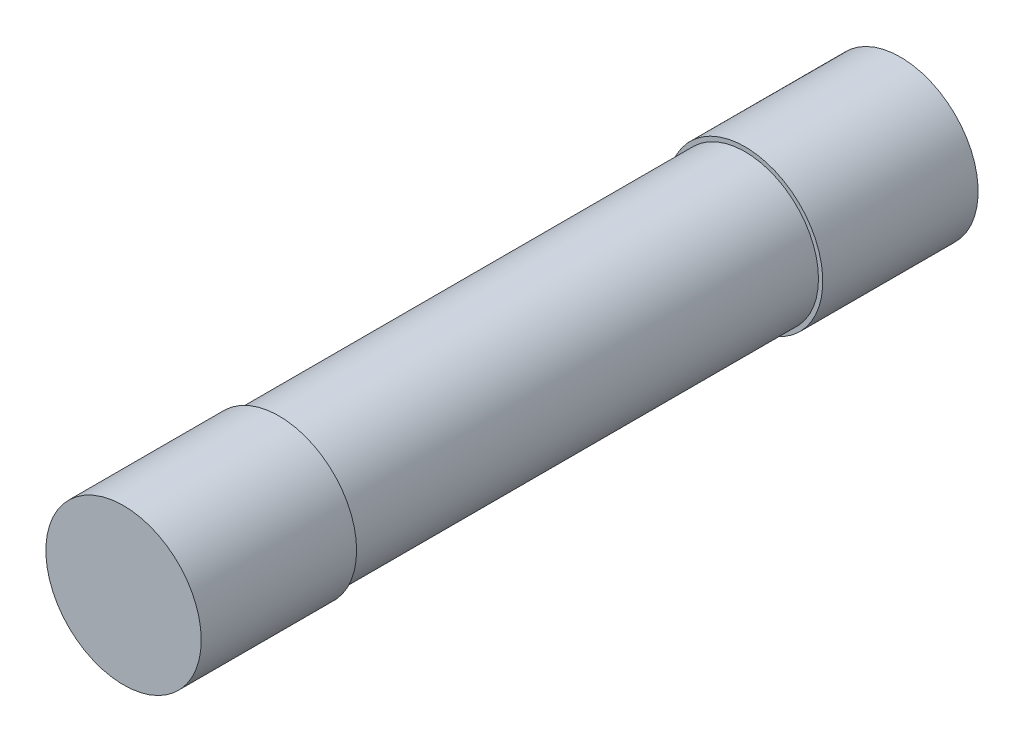
ISO-10303-21;
HEADER;
FILE_DESCRIPTION(('STEP AP214'),'2;1');
FILE_NAME('part.step','',(''),(''),'','','');
FILE_SCHEMA(('AUTOMOTIVE_DESIGN { 1 0 10303 214 1 1 1 1 }'));
ENDSEC;
DATA;
#1=APPLICATION_CONTEXT('core data for automotive mechanical design processes');
#2=APPLICATION_PROTOCOL_DEFINITION('international standard','automotive_design',2000,#1);
#3=PRODUCT_CONTEXT('',#1,'mechanical');
#4=PRODUCT('Part','Part','',(#3));
#5=PRODUCT_RELATED_PRODUCT_CATEGORY('part','',(#4));
#6=PRODUCT_DEFINITION_FORMATION('','',#4);
#7=PRODUCT_DEFINITION_CONTEXT('part definition',#1,'design');
#8=PRODUCT_DEFINITION('design','',#6,#7);
#9=PRODUCT_DEFINITION_SHAPE('','',#8);
#10=(LENGTH_UNIT() NAMED_UNIT(*) SI_UNIT(.MILLI.,.METRE.));
#11=(NAMED_UNIT(*) PLANE_ANGLE_UNIT() SI_UNIT($,.RADIAN.));
#12=(NAMED_UNIT(*) SI_UNIT($,.STERADIAN.) SOLID_ANGLE_UNIT());
#13=UNCERTAINTY_MEASURE_WITH_UNIT(LENGTH_MEASURE(1.E-05),#10,'distance_accuracy_value','');
#14=(GEOMETRIC_REPRESENTATION_CONTEXT(3) GLOBAL_UNCERTAINTY_ASSIGNED_CONTEXT((#13)) GLOBAL_UNIT_ASSIGNED_CONTEXT((#10,
#11,#12)) REPRESENTATION_CONTEXT('',''));
#15=CARTESIAN_POINT('',(0.,0.,0.));
#16=DIRECTION('',(0.,0.,1.));
#17=DIRECTION('',(1.,0.,0.));
#18=AXIS2_PLACEMENT_3D('',#15,#16,#17);
#19=CARTESIAN_POINT('',(0.,0.,-25.4));
#20=DIRECTION('',(0.,0.,1.));
#21=DIRECTION('',(1.,0.,0.));
#22=AXIS2_PLACEMENT_3D('',#19,#20,#21);
#23=CYLINDRICAL_SURFACE('',#22,3.175);
#24=CARTESIAN_POINT('',(0.,0.,-25.4));
#25=DIRECTION('',(0.,0.,-1.));
#26=DIRECTION('',(-1.,0.,0.));
#27=AXIS2_PLACEMENT_3D('',#24,#25,#26);
#28=CIRCLE('',#27,3.175);
#29=CARTESIAN_POINT('',(-3.175,0.,-25.4));
#30=VERTEX_POINT('',#29);
#31=EDGE_CURVE('E11',#30,#30,#28,.T.);
#32=ORIENTED_EDGE('',*,*,#31,.F.);
#33=EDGE_LOOP('',(#32));
#34=FACE_BOUND('',#33,.T.);
#35=CARTESIAN_POINT('',(0.,0.,-19.05));
#36=DIRECTION('',(0.,0.,-1.));
#37=DIRECTION('',(-1.,0.,0.));
#38=AXIS2_PLACEMENT_3D('',#35,#36,#37);
#39=CIRCLE('',#38,3.175);
#40=CARTESIAN_POINT('',(-3.175,0.,-19.05));
#41=VERTEX_POINT('',#40);
#42=EDGE_CURVE('E47',#41,#41,#39,.T.);
#43=ORIENTED_EDGE('',*,*,#42,.T.);
#44=EDGE_LOOP('',(#43));
#45=FACE_BOUND('',#44,.T.);
#46=ADVANCED_FACE('F44',(#34,#45),#23,.T.);
#47=CARTESIAN_POINT('',(0.,0.,-25.4));
#48=DIRECTION('',(0.,0.,-1.));
#49=DIRECTION('',(-1.,0.,0.));
#50=AXIS2_PLACEMENT_3D('',#47,#48,#49);
#51=PLANE('',#50);
#52=ORIENTED_EDGE('',*,*,#31,.T.);
#53=EDGE_LOOP('',(#52));
#54=FACE_BOUND('',#53,.T.);
#55=ADVANCED_FACE('F59',(#54),#51,.T.);
#56=CARTESIAN_POINT('',(0.,0.,-19.05));
#57=DIRECTION('',(0.,0.,-1.));
#58=DIRECTION('',(-1.,0.,0.));
#59=AXIS2_PLACEMENT_3D('',#56,#57,#58);
#60=PLANE('',#59);
#61=ORIENTED_EDGE('',*,*,#42,.F.);
#62=EDGE_LOOP('',(#61));
#63=FACE_BOUND('',#62,.T.);
#64=ADVANCED_FACE('F57',(#63),#60,.F.);
#65=CLOSED_SHELL('',(#46,#55,#64));
#66=MANIFOLD_SOLID_BREP('B2',#65);
#67=CARTESIAN_POINT('',(0.,0.,-19.05));
#68=DIRECTION('',(0.,0.,1.));
#69=DIRECTION('',(1.,0.,0.));
#70=AXIS2_PLACEMENT_3D('',#67,#68,#69);
#71=CYLINDRICAL_SURFACE('',#70,3.);
#72=CARTESIAN_POINT('',(0.,0.,-19.05));
#73=DIRECTION('',(0.,0.,-1.));
#74=DIRECTION('',(-1.,0.,0.));
#75=AXIS2_PLACEMENT_3D('',#72,#73,#74);
#76=CIRCLE('',#75,3.);
#77=CARTESIAN_POINT('',(3.,0.,-19.05));
#78=VERTEX_POINT('',#77);
#79=EDGE_CURVE('E43',#78,#78,#76,.T.);
#80=CARTESIAN_POINT('',(0.,0.,0.));
#81=DIRECTION('',(0.,0.,-1.));
#82=DIRECTION('',(-1.,0.,0.));
#83=AXIS2_PLACEMENT_3D('',#80,#81,#82);
#84=CIRCLE('',#83,3.);
#85=CARTESIAN_POINT('',(3.,0.,0.));
#86=VERTEX_POINT('',#85);
#87=EDGE_CURVE('E95',#86,#86,#84,.T.);
#88=CARTESIAN_POINT('',(3.,0.,-19.05));
#89=CARTESIAN_POINT('',(3.,0.,-18.8515625));
#90=CARTESIAN_POINT('',(3.,0.,-18.653125));
#91=CARTESIAN_POINT('',(3.,0.,-18.25625));
#92=CARTESIAN_POINT('',(3.,0.,-18.0578125));
#93=CARTESIAN_POINT('',(3.,0.,-17.6609375));
#94=CARTESIAN_POINT('',(3.,0.,-17.4625));
#95=CARTESIAN_POINT('',(3.,0.,-17.065625));
#96=CARTESIAN_POINT('',(3.,0.,-16.8671875));
#97=CARTESIAN_POINT('',(3.,0.,-16.4703125));
#98=CARTESIAN_POINT('',(3.,0.,-16.271875));
#99=CARTESIAN_POINT('',(3.,0.,-15.875));
#100=CARTESIAN_POINT('',(3.,0.,-15.6765625));
#101=CARTESIAN_POINT('',(3.,0.,-15.2796875));
#102=CARTESIAN_POINT('',(3.,0.,-15.08125));
#103=CARTESIAN_POINT('',(3.,0.,-14.684375));
#104=CARTESIAN_POINT('',(3.,0.,-14.4859375));
#105=CARTESIAN_POINT('',(3.,0.,-14.0890625));
#106=CARTESIAN_POINT('',(3.,0.,-13.890625));
#107=CARTESIAN_POINT('',(3.,0.,-13.49375));
#108=CARTESIAN_POINT('',(3.,0.,-13.2953125));
#109=CARTESIAN_POINT('',(3.,0.,-12.8984375));
#110=CARTESIAN_POINT('',(3.,0.,-12.7));
#111=CARTESIAN_POINT('',(3.,0.,-12.303125));
#112=CARTESIAN_POINT('',(3.,0.,-12.1046875));
#113=CARTESIAN_POINT('',(3.,0.,-11.7078125));
#114=CARTESIAN_POINT('',(3.,0.,-11.509375));
#115=CARTESIAN_POINT('',(3.,0.,-11.1125));
#116=CARTESIAN_POINT('',(3.,0.,-10.9140625));
#117=CARTESIAN_POINT('',(3.,0.,-10.5171875));
#118=CARTESIAN_POINT('',(3.,0.,-10.31875));
#119=CARTESIAN_POINT('',(3.,0.,-9.921875));
#120=CARTESIAN_POINT('',(3.,0.,-9.7234375));
#121=CARTESIAN_POINT('',(3.,0.,-9.3265625));
#122=CARTESIAN_POINT('',(3.,0.,-9.128125));
#123=CARTESIAN_POINT('',(3.,0.,-8.73125));
#124=CARTESIAN_POINT('',(3.,0.,-8.5328125));
#125=CARTESIAN_POINT('',(3.,0.,-8.1359375));
#126=CARTESIAN_POINT('',(3.,0.,-7.9375));
#127=CARTESIAN_POINT('',(3.,0.,-7.540625));
#128=CARTESIAN_POINT('',(3.,0.,-7.3421875));
#129=CARTESIAN_POINT('',(3.,0.,-6.9453125));
#130=CARTESIAN_POINT('',(3.,0.,-6.746875));
#131=CARTESIAN_POINT('',(3.,0.,-6.35));
#132=CARTESIAN_POINT('',(3.,0.,-6.1515625));
#133=CARTESIAN_POINT('',(3.,0.,-5.7546875));
#134=CARTESIAN_POINT('',(3.,0.,-5.55625));
#135=CARTESIAN_POINT('',(3.,0.,-5.159375));
#136=CARTESIAN_POINT('',(3.,0.,-4.9609375));
#137=CARTESIAN_POINT('',(3.,0.,-4.5640625));
#138=CARTESIAN_POINT('',(3.,0.,-4.365625));
#139=CARTESIAN_POINT('',(3.,0.,-3.96875));
#140=CARTESIAN_POINT('',(3.,0.,-3.7703125));
#141=CARTESIAN_POINT('',(3.,0.,-3.3734375));
#142=CARTESIAN_POINT('',(3.,0.,-3.175));
#143=CARTESIAN_POINT('',(3.,0.,-2.778125));
#144=CARTESIAN_POINT('',(3.,0.,-2.5796875));
#145=CARTESIAN_POINT('',(3.,0.,-2.1828125));
#146=CARTESIAN_POINT('',(3.,0.,-1.984375));
#147=CARTESIAN_POINT('',(3.,0.,-1.5875));
#148=CARTESIAN_POINT('',(3.,0.,-1.3890625));
#149=CARTESIAN_POINT('',(3.,0.,-0.992187500000001));
#150=CARTESIAN_POINT('',(3.,0.,-0.793750000000001));
#151=CARTESIAN_POINT('',(3.,0.,-0.396875));
#152=CARTESIAN_POINT('',(3.,0.,-0.1984375));
#153=CARTESIAN_POINT('',(3.,0.,0.));
#154=B_SPLINE_CURVE_WITH_KNOTS('',3,(#88,#89,#90,#91,#92,#93,#94,#95,#96,#97,#98,#99,#100,#101,
#102,#103,#104,#105,#106,#107,#108,#109,#110,#111,#112,#113,#114,#115,#116,#117,#118,#119,#120,
#121,#122,#123,#124,#125,#126,#127,#128,#129,#130,#131,#132,#133,#134,#135,#136,#137,#138,#139,
#140,#141,#142,#143,#144,#145,#146,#147,#148,#149,#150,#151,#152,#153),.UNSPECIFIED.,.F.,.F.,(4,
2,2,2,2,2,2,2,2,2,2,2,2,2,2,2,2,2,2,2,2,2,2,2,2,2,2,2,2,2,2,2,4),(0.,0.5953125,1.190625,
1.7859375,2.38125,2.9765625,3.571875,4.1671875,4.7625,5.3578125,5.953125,6.5484375,7.14375,
7.7390625,8.334375,8.9296875,9.525,10.1203125,10.715625,11.3109375,11.90625,12.5015625,
13.096875,13.6921875,14.2875,14.8828125,15.478125,16.0734375,16.66875,17.2640625,17.859375,
18.4546875,19.05),.UNSPECIFIED.);
#155=EDGE_CURVE('BSEAM92',#78,#86,#154,.T.);
#156=ORIENTED_EDGE('',*,*,#79,.F.);
#157=ORIENTED_EDGE('',*,*,#87,.T.);
#158=ORIENTED_EDGE('',*,*,#155,.T.);
#159=ORIENTED_EDGE('',*,*,#155,.F.);
#160=EDGE_LOOP('',(#156,#158,#157,#159));
#161=FACE_BOUND('',#160,.T.);
#162=ADVANCED_FACE('F92',(#161),#71,.T.);
#163=CARTESIAN_POINT('',(0.,0.,-19.05));
#164=DIRECTION('',(0.,0.,-1.));
#165=DIRECTION('',(-1.,0.,0.));
#166=AXIS2_PLACEMENT_3D('',#163,#164,#165);
#167=PLANE('',#166);
#168=ORIENTED_EDGE('',*,*,#79,.T.);
#169=EDGE_LOOP('',(#168));
#170=FACE_BOUND('',#169,.T.);
#171=ADVANCED_FACE('F107',(#170),#167,.T.);
#172=CARTESIAN_POINT('',(0.,0.,0.));
#173=DIRECTION('',(0.,0.,-1.));
#174=DIRECTION('',(-1.,0.,0.));
#175=AXIS2_PLACEMENT_3D('',#172,#173,#174);
#176=PLANE('',#175);
#177=ORIENTED_EDGE('',*,*,#87,.F.);
#178=EDGE_LOOP('',(#177));
#179=FACE_BOUND('',#178,.T.);
#180=ADVANCED_FACE('F105',(#179),#176,.F.);
#181=CLOSED_SHELL('',(#162,#171,#180));
#182=MANIFOLD_SOLID_BREP('B6',#181);
#183=CARTESIAN_POINT('',(0.,0.,6.35));
#184=DIRECTION('',(0.,0.,-1.));
#185=DIRECTION('',(-1.,0.,0.));
#186=AXIS2_PLACEMENT_3D('',#183,#184,#185);
#187=CYLINDRICAL_SURFACE('',#186,3.175);
#188=CARTESIAN_POINT('',(0.,0.,6.35));
#189=DIRECTION('',(0.,0.,1.));
#190=DIRECTION('',(1.,0.,0.));
#191=AXIS2_PLACEMENT_3D('',#188,#189,#190);
#192=CIRCLE('',#191,3.175);
#193=CARTESIAN_POINT('',(3.175,0.,6.35));
#194=VERTEX_POINT('',#193);
#195=EDGE_CURVE('E91',#194,#194,#192,.T.);
#196=ORIENTED_EDGE('',*,*,#195,.F.);
#197=EDGE_LOOP('',(#196));
#198=FACE_BOUND('',#197,.T.);
#199=CARTESIAN_POINT('',(0.,0.,0.));
#200=DIRECTION('',(0.,0.,1.));
#201=DIRECTION('',(1.,0.,0.));
#202=AXIS2_PLACEMENT_3D('',#199,#200,#201);
#203=CIRCLE('',#202,3.175);
#204=CARTESIAN_POINT('',(3.175,0.,0.));
#205=VERTEX_POINT('',#204);
#206=EDGE_CURVE('E136',#205,#205,#203,.T.);
#207=ORIENTED_EDGE('',*,*,#206,.T.);
#208=EDGE_LOOP('',(#207));
#209=FACE_BOUND('',#208,.T.);
#210=ADVANCED_FACE('F133',(#198,#209),#187,.T.);
#211=CARTESIAN_POINT('',(0.,0.,6.35));
#212=DIRECTION('',(0.,0.,1.));
#213=DIRECTION('',(1.,0.,0.));
#214=AXIS2_PLACEMENT_3D('',#211,#212,#213);
#215=PLANE('',#214);
#216=ORIENTED_EDGE('',*,*,#195,.T.);
#217=EDGE_LOOP('',(#216));
#218=FACE_BOUND('',#217,.T.);
#219=ADVANCED_FACE('F148',(#218),#215,.T.);
#220=CARTESIAN_POINT('',(0.,0.,0.));
#221=DIRECTION('',(0.,0.,1.));
#222=DIRECTION('',(1.,0.,0.));
#223=AXIS2_PLACEMENT_3D('',#220,#221,#222);
#224=PLANE('',#223);
#225=ORIENTED_EDGE('',*,*,#206,.F.);
#226=EDGE_LOOP('',(#225));
#227=FACE_BOUND('',#226,.T.);
#228=ADVANCED_FACE('F146',(#227),#224,.F.);
#229=CLOSED_SHELL('',(#210,#219,#228));
#230=MANIFOLD_SOLID_BREP('B38',#229);
#231=ADVANCED_BREP_SHAPE_REPRESENTATION('',(#18,#66,#182,#230),#14);
#232=SHAPE_DEFINITION_REPRESENTATION(#9,#231);
ENDSEC;
END-ISO-10303-21;
